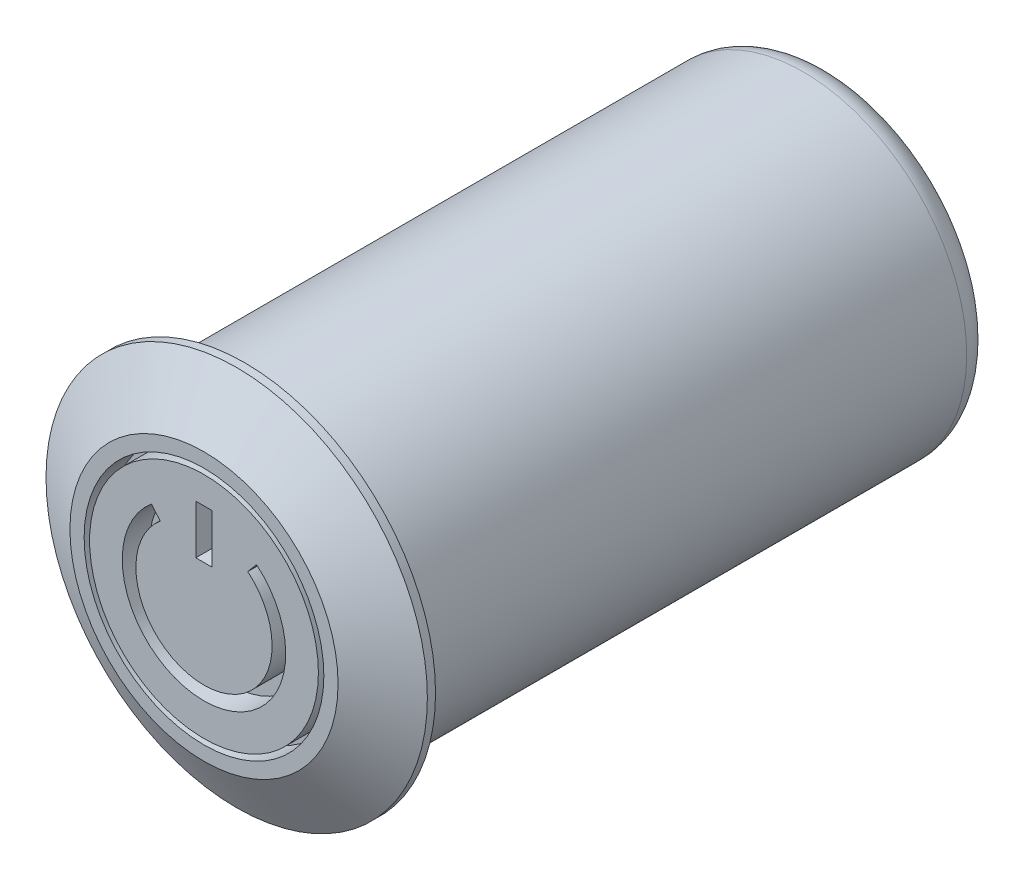
ISO-10303-21;
HEADER;
FILE_DESCRIPTION(('STEP AP214'),'2;1');
FILE_NAME('part.step','',(''),(''),'','','');
FILE_SCHEMA(('AUTOMOTIVE_DESIGN { 1 0 10303 214 1 1 1 1 }'));
ENDSEC;
DATA;
#1=APPLICATION_CONTEXT('core data for automotive mechanical design processes');
#2=APPLICATION_PROTOCOL_DEFINITION('international standard','automotive_design',2000,#1);
#3=PRODUCT_CONTEXT('',#1,'mechanical');
#4=PRODUCT('Part','Part','',(#3));
#5=PRODUCT_RELATED_PRODUCT_CATEGORY('part','',(#4));
#6=PRODUCT_DEFINITION_FORMATION('','',#4);
#7=PRODUCT_DEFINITION_CONTEXT('part definition',#1,'design');
#8=PRODUCT_DEFINITION('design','',#6,#7);
#9=PRODUCT_DEFINITION_SHAPE('','',#8);
#10=(LENGTH_UNIT() NAMED_UNIT(*) SI_UNIT(.MILLI.,.METRE.));
#11=(NAMED_UNIT(*) PLANE_ANGLE_UNIT() SI_UNIT($,.RADIAN.));
#12=(NAMED_UNIT(*) SI_UNIT($,.STERADIAN.) SOLID_ANGLE_UNIT());
#13=UNCERTAINTY_MEASURE_WITH_UNIT(LENGTH_MEASURE(1.E-05),#10,'distance_accuracy_value','');
#14=(GEOMETRIC_REPRESENTATION_CONTEXT(3) GLOBAL_UNCERTAINTY_ASSIGNED_CONTEXT((#13)) GLOBAL_UNIT_ASSIGNED_CONTEXT((#10,
#11,#12)) REPRESENTATION_CONTEXT('',''));
#15=CARTESIAN_POINT('',(0.,0.,0.));
#16=DIRECTION('',(0.,0.,1.));
#17=DIRECTION('',(1.,0.,0.));
#18=AXIS2_PLACEMENT_3D('',#15,#16,#17);
#19=CARTESIAN_POINT('',(0.,0.,1.5));
#20=DIRECTION('',(0.,0.,-1.));
#21=DIRECTION('',(-1.,0.,0.));
#22=AXIS2_PLACEMENT_3D('',#19,#20,#21);
#23=CYLINDRICAL_SURFACE('',#22,7.);
#24=CARTESIAN_POINT('',(0.,0.,0.299999999999999));
#25=DIRECTION('',(0.,0.,1.));
#26=DIRECTION('',(1.,0.,0.));
#27=AXIS2_PLACEMENT_3D('',#24,#25,#26);
#28=CIRCLE('',#27,7.);
#29=CARTESIAN_POINT('',(7.,0.,0.299999999999999));
#30=VERTEX_POINT('',#29);
#31=EDGE_CURVE('E232',#30,#30,#28,.F.);
#32=ORIENTED_EDGE('',*,*,#31,.T.);
#33=EDGE_LOOP('',(#32));
#34=FACE_BOUND('',#33,.T.);
#35=CARTESIAN_POINT('',(0.,0.,0.));
#36=DIRECTION('',(0.,0.,1.));
#37=DIRECTION('',(1.,0.,0.));
#38=AXIS2_PLACEMENT_3D('',#35,#36,#37);
#39=CIRCLE('',#38,7.);
#40=CARTESIAN_POINT('',(7.,0.,0.));
#41=VERTEX_POINT('',#40);
#42=EDGE_CURVE('E221',#41,#41,#39,.T.);
#43=ORIENTED_EDGE('',*,*,#42,.T.);
#44=EDGE_LOOP('',(#43));
#45=FACE_BOUND('',#44,.T.);
#46=ADVANCED_FACE('F91',(#34,#45),#23,.T.);
#47=CARTESIAN_POINT('',(0.,0.,1.5));
#48=DIRECTION('',(0.,0.,1.));
#49=DIRECTION('',(1.,0.,0.));
#50=AXIS2_PLACEMENT_3D('',#47,#48,#49);
#51=PLANE('',#50);
#52=CARTESIAN_POINT('',(0.,0.,1.5));
#53=DIRECTION('',(0.,0.,1.));
#54=DIRECTION('',(1.,0.,0.));
#55=AXIS2_PLACEMENT_3D('',#52,#53,#54);
#56=CIRCLE('',#55,4.4);
#57=CARTESIAN_POINT('',(4.4,0.,1.5));
#58=VERTEX_POINT('',#57);
#59=EDGE_CURVE('E181',#58,#58,#56,.T.);
#60=ORIENTED_EDGE('',*,*,#59,.F.);
#61=EDGE_LOOP('',(#60));
#62=FACE_BOUND('',#61,.T.);
#63=CARTESIAN_POINT('',(0.,0.,1.5));
#64=DIRECTION('',(0.,0.,1.));
#65=DIRECTION('',(1.,0.,0.));
#66=AXIS2_PLACEMENT_3D('',#63,#64,#65);
#67=CIRCLE('',#66,4.92153903091735);
#68=CARTESIAN_POINT('',(4.92153903091735,0.,1.5));
#69=VERTEX_POINT('',#68);
#70=EDGE_CURVE('E229',#69,#69,#67,.T.);
#71=ORIENTED_EDGE('',*,*,#70,.T.);
#72=EDGE_LOOP('',(#71));
#73=FACE_BOUND('',#72,.T.);
#74=ADVANCED_FACE('F251',(#62,#73),#51,.T.);
#75=CARTESIAN_POINT('',(0.,0.,0.));
#76=DIRECTION('',(0.,0.,1.));
#77=DIRECTION('',(1.,0.,0.));
#78=AXIS2_PLACEMENT_3D('',#75,#76,#77);
#79=PLANE('',#78);
#80=CARTESIAN_POINT('',(0.,0.,0.));
#81=DIRECTION('',(0.,0.,1.));
#82=DIRECTION('',(1.,0.,0.));
#83=AXIS2_PLACEMENT_3D('',#80,#81,#82);
#84=CIRCLE('',#83,6.);
#85=CARTESIAN_POINT('',(6.,0.,0.));
#86=VERTEX_POINT('',#85);
#87=EDGE_CURVE('E235',#86,#86,#84,.F.);
#88=ORIENTED_EDGE('',*,*,#87,.F.);
#89=EDGE_LOOP('',(#88));
#90=FACE_BOUND('',#89,.T.);
#91=ORIENTED_EDGE('',*,*,#42,.F.);
#92=EDGE_LOOP('',(#91));
#93=FACE_BOUND('',#92,.T.);
#94=ADVANCED_FACE('F257',(#90,#93),#79,.F.);
#95=CARTESIAN_POINT('',(0.,0.,1.5));
#96=DIRECTION('',(0.,0.,-1.));
#97=DIRECTION('',(-1.,0.,0.));
#98=AXIS2_PLACEMENT_3D('',#95,#96,#97);
#99=CONICAL_SURFACE('',#98,4.92153903091735,1.0471975511966);
#100=ORIENTED_EDGE('',*,*,#31,.F.);
#101=EDGE_LOOP('',(#100));
#102=FACE_BOUND('',#101,.T.);
#103=ORIENTED_EDGE('',*,*,#70,.F.);
#104=EDGE_LOOP('',(#103));
#105=FACE_BOUND('',#104,.T.);
#106=ADVANCED_FACE('F263',(#102,#105),#99,.T.);
#107=CARTESIAN_POINT('',(0.,0.,0.5));
#108=DIRECTION('',(0.,0.,1.));
#109=DIRECTION('',(1.,0.,0.));
#110=AXIS2_PLACEMENT_3D('',#107,#108,#109);
#111=CYLINDRICAL_SURFACE('',#110,4.2);
#112=CARTESIAN_POINT('',(0.,0.,0.5));
#113=DIRECTION('',(0.,0.,1.));
#114=DIRECTION('',(1.,0.,0.));
#115=AXIS2_PLACEMENT_3D('',#112,#113,#114);
#116=CIRCLE('',#115,4.2);
#117=CARTESIAN_POINT('',(4.2,0.,0.5));
#118=VERTEX_POINT('',#117);
#119=EDGE_CURVE('E345',#118,#118,#116,.T.);
#120=ORIENTED_EDGE('',*,*,#119,.T.);
#121=EDGE_LOOP('',(#120));
#122=FACE_BOUND('',#121,.T.);
#123=CARTESIAN_POINT('',(0.,0.,1.5));
#124=DIRECTION('',(0.,0.,1.));
#125=DIRECTION('',(1.,0.,0.));
#126=AXIS2_PLACEMENT_3D('',#123,#124,#125);
#127=CIRCLE('',#126,4.2);
#128=CARTESIAN_POINT('',(4.2,0.,1.5));
#129=VERTEX_POINT('',#128);
#130=EDGE_CURVE('E342',#129,#129,#127,.T.);
#131=ORIENTED_EDGE('',*,*,#130,.F.);
#132=EDGE_LOOP('',(#131));
#133=FACE_BOUND('',#132,.T.);
#134=ADVANCED_FACE('F265',(#122,#133),#111,.T.);
#135=CARTESIAN_POINT('',(0.,0.,0.5));
#136=DIRECTION('',(0.,0.,1.));
#137=DIRECTION('',(1.,0.,0.));
#138=AXIS2_PLACEMENT_3D('',#135,#136,#137);
#139=CYLINDRICAL_SURFACE('',#138,4.4);
#140=CARTESIAN_POINT('',(0.,0.,0.5));
#141=DIRECTION('',(0.,0.,1.));
#142=DIRECTION('',(1.,0.,0.));
#143=AXIS2_PLACEMENT_3D('',#140,#141,#142);
#144=CIRCLE('',#143,4.4);
#145=CARTESIAN_POINT('',(4.4,0.,0.5));
#146=VERTEX_POINT('',#145);
#147=EDGE_CURVE('E188',#146,#146,#144,.T.);
#148=ORIENTED_EDGE('',*,*,#147,.F.);
#149=EDGE_LOOP('',(#148));
#150=FACE_BOUND('',#149,.T.);
#151=ORIENTED_EDGE('',*,*,#59,.T.);
#152=EDGE_LOOP('',(#151));
#153=FACE_BOUND('',#152,.T.);
#154=ADVANCED_FACE('F271',(#150,#153),#139,.F.);
#155=CARTESIAN_POINT('',(0.,0.,0.5));
#156=DIRECTION('',(0.,0.,1.));
#157=DIRECTION('',(1.,0.,0.));
#158=AXIS2_PLACEMENT_3D('',#155,#156,#157);
#159=PLANE('',#158);
#160=ORIENTED_EDGE('',*,*,#119,.F.);
#161=EDGE_LOOP('',(#160));
#162=FACE_BOUND('',#161,.T.);
#163=ORIENTED_EDGE('',*,*,#147,.T.);
#164=EDGE_LOOP('',(#163));
#165=FACE_BOUND('',#164,.T.);
#166=ADVANCED_FACE('F293',(#162,#165),#159,.T.);
#167=CARTESIAN_POINT('',(0.,0.,0.5));
#168=DIRECTION('',(0.,0.,1.));
#169=DIRECTION('',(1.,0.,0.));
#170=AXIS2_PLACEMENT_3D('',#167,#168,#169);
#171=PLANE('',#170);
#172=DIRECTION('',(1.,0.,0.));
#173=VECTOR('',#172,1.);
#174=CARTESIAN_POINT('',(0.,1.4,0.5));
#175=LINE('',#174,#173);
#176=CARTESIAN_POINT('',(-0.3,1.4,0.5));
#177=VERTEX_POINT('',#176);
#178=CARTESIAN_POINT('',(0.3,1.4,0.5));
#179=VERTEX_POINT('',#178);
#180=EDGE_CURVE('E197',#177,#179,#175,.T.);
#181=ORIENTED_EDGE('',*,*,#180,.T.);
#182=DIRECTION('',(0.,1.,0.));
#183=VECTOR('',#182,1.);
#184=CARTESIAN_POINT('',(0.3,0.,0.5));
#185=LINE('',#184,#183);
#186=CARTESIAN_POINT('',(0.3,3.2,0.5));
#187=VERTEX_POINT('',#186);
#188=EDGE_CURVE('E200',#179,#187,#185,.T.);
#189=ORIENTED_EDGE('',*,*,#188,.T.);
#190=DIRECTION('',(1.,0.,0.));
#191=VECTOR('',#190,1.);
#192=CARTESIAN_POINT('',(0.,3.2,0.5));
#193=LINE('',#192,#191);
#194=CARTESIAN_POINT('',(-0.3,3.2,0.5));
#195=VERTEX_POINT('',#194);
#196=EDGE_CURVE('E204',#195,#187,#193,.T.);
#197=ORIENTED_EDGE('',*,*,#196,.F.);
#198=DIRECTION('',(0.,-1.,0.));
#199=VECTOR('',#198,1.);
#200=CARTESIAN_POINT('',(-0.3,0.,0.5));
#201=LINE('',#200,#199);
#202=EDGE_CURVE('E206',#195,#177,#201,.T.);
#203=ORIENTED_EDGE('',*,*,#202,.T.);
#204=EDGE_LOOP('',(#181,#189,#197,#203));
#205=FACE_BOUND('',#204,.T.);
#206=ADVANCED_FACE('F296',(#205),#171,.T.);
#207=CARTESIAN_POINT('',(0.3,0.,0.5));
#208=DIRECTION('',(1.,0.,0.));
#209=DIRECTION('',(0.,0.,-1.));
#210=AXIS2_PLACEMENT_3D('',#207,#208,#209);
#211=PLANE('',#210);
#212=DIRECTION('',(0.,1.,0.));
#213=VECTOR('',#212,1.);
#214=CARTESIAN_POINT('',(0.3,0.,1.5));
#215=LINE('',#214,#213);
#216=CARTESIAN_POINT('',(0.3,1.4,1.5));
#217=VERTEX_POINT('',#216);
#218=CARTESIAN_POINT('',(0.3,3.2,1.5));
#219=VERTEX_POINT('',#218);
#220=EDGE_CURVE('E211',#217,#219,#215,.T.);
#221=ORIENTED_EDGE('',*,*,#220,.T.);
#222=DIRECTION('',(0.,0.,1.));
#223=VECTOR('',#222,1.);
#224=CARTESIAN_POINT('',(0.3,3.2,0.5));
#225=LINE('',#224,#223);
#226=EDGE_CURVE('E224',#187,#219,#225,.T.);
#227=ORIENTED_EDGE('',*,*,#226,.F.);
#228=ORIENTED_EDGE('',*,*,#188,.F.);
#229=DIRECTION('',(0.,0.,1.));
#230=VECTOR('',#229,1.);
#231=CARTESIAN_POINT('',(0.3,1.4,0.5));
#232=LINE('',#231,#230);
#233=EDGE_CURVE('E209',#179,#217,#232,.T.);
#234=ORIENTED_EDGE('',*,*,#233,.T.);
#235=EDGE_LOOP('',(#221,#227,#228,#234));
#236=FACE_BOUND('',#235,.T.);
#237=ADVANCED_FACE('F315',(#236),#211,.F.);
#238=CARTESIAN_POINT('',(0.,3.2,0.5));
#239=DIRECTION('',(0.,-1.,0.));
#240=DIRECTION('',(0.,0.,-1.));
#241=AXIS2_PLACEMENT_3D('',#238,#239,#240);
#242=PLANE('',#241);
#243=DIRECTION('',(1.,0.,0.));
#244=VECTOR('',#243,1.);
#245=CARTESIAN_POINT('',(0.,3.2,1.5));
#246=LINE('',#245,#244);
#247=CARTESIAN_POINT('',(-0.3,3.2,1.5));
#248=VERTEX_POINT('',#247);
#249=EDGE_CURVE('E214',#248,#219,#246,.T.);
#250=ORIENTED_EDGE('',*,*,#249,.F.);
#251=DIRECTION('',(0.,0.,1.));
#252=VECTOR('',#251,1.);
#253=CARTESIAN_POINT('',(-0.3,3.2,0.5));
#254=LINE('',#253,#252);
#255=EDGE_CURVE('E222',#195,#248,#254,.T.);
#256=ORIENTED_EDGE('',*,*,#255,.F.);
#257=ORIENTED_EDGE('',*,*,#196,.T.);
#258=ORIENTED_EDGE('',*,*,#226,.T.);
#259=EDGE_LOOP('',(#250,#256,#257,#258));
#260=FACE_BOUND('',#259,.T.);
#261=ADVANCED_FACE('F321',(#260),#242,.T.);
#262=CARTESIAN_POINT('',(-0.3,0.,0.5));
#263=DIRECTION('',(-1.,0.,0.));
#264=DIRECTION('',(0.,-1.,0.));
#265=AXIS2_PLACEMENT_3D('',#262,#263,#264);
#266=PLANE('',#265);
#267=DIRECTION('',(0.,-1.,0.));
#268=VECTOR('',#267,1.);
#269=CARTESIAN_POINT('',(-0.3,0.,1.5));
#270=LINE('',#269,#268);
#271=CARTESIAN_POINT('',(-0.3,1.4,1.5));
#272=VERTEX_POINT('',#271);
#273=EDGE_CURVE('E201',#248,#272,#270,.T.);
#274=ORIENTED_EDGE('',*,*,#273,.T.);
#275=DIRECTION('',(0.,0.,1.));
#276=VECTOR('',#275,1.);
#277=CARTESIAN_POINT('',(-0.3,1.4,0.5));
#278=LINE('',#277,#276);
#279=EDGE_CURVE('E219',#177,#272,#278,.T.);
#280=ORIENTED_EDGE('',*,*,#279,.F.);
#281=ORIENTED_EDGE('',*,*,#202,.F.);
#282=ORIENTED_EDGE('',*,*,#255,.T.);
#283=EDGE_LOOP('',(#274,#280,#281,#282));
#284=FACE_BOUND('',#283,.T.);
#285=ADVANCED_FACE('F317',(#284),#266,.F.);
#286=CARTESIAN_POINT('',(0.,1.4,0.5));
#287=DIRECTION('',(0.,-1.,0.));
#288=DIRECTION('',(0.,0.,-1.));
#289=AXIS2_PLACEMENT_3D('',#286,#287,#288);
#290=PLANE('',#289);
#291=DIRECTION('',(1.,0.,0.));
#292=VECTOR('',#291,1.);
#293=CARTESIAN_POINT('',(0.,1.4,1.5));
#294=LINE('',#293,#292);
#295=EDGE_CURVE('E114',#272,#217,#294,.T.);
#296=ORIENTED_EDGE('',*,*,#295,.T.);
#297=ORIENTED_EDGE('',*,*,#233,.F.);
#298=ORIENTED_EDGE('',*,*,#180,.F.);
#299=ORIENTED_EDGE('',*,*,#279,.T.);
#300=EDGE_LOOP('',(#296,#297,#298,#299));
#301=FACE_BOUND('',#300,.T.);
#302=ADVANCED_FACE('F320',(#301),#290,.F.);
#303=DIRECTION('',(-0.642787609686543,0.766044443118975,0.));
#304=VECTOR('',#303,1.);
#305=CARTESIAN_POINT('',(0.,0.,1.5));
#306=LINE('',#305,#304);
#307=CARTESIAN_POINT('',(-1.60696902421636,1.91511110779744,1.5));
#308=VERTEX_POINT('',#307);
#309=CARTESIAN_POINT('',(-1.92836282905963,2.29813332935692,1.5));
#310=VERTEX_POINT('',#309);
#311=EDGE_CURVE('E106',#308,#310,#306,.T.);
#312=ORIENTED_EDGE('',*,*,#311,.F.);
#313=CARTESIAN_POINT('',(0.,0.,1.5));
#314=DIRECTION('',(0.,0.,1.));
#315=DIRECTION('',(1.,0.,0.));
#316=AXIS2_PLACEMENT_3D('',#313,#314,#315);
#317=CIRCLE('',#316,2.5);
#318=CARTESIAN_POINT('',(1.60696902421635,1.91511110779745,1.5));
#319=VERTEX_POINT('',#318);
#320=EDGE_CURVE('E175',#308,#319,#317,.T.);
#321=ORIENTED_EDGE('',*,*,#320,.T.);
#322=DIRECTION('',(0.642787609686538,0.766044443118979,0.));
#323=VECTOR('',#322,1.);
#324=CARTESIAN_POINT('',(0.,0.,1.5));
#325=LINE('',#324,#323);
#326=CARTESIAN_POINT('',(1.92836282905961,2.29813332935694,1.5));
#327=VERTEX_POINT('',#326);
#328=EDGE_CURVE('E178',#319,#327,#325,.T.);
#329=ORIENTED_EDGE('',*,*,#328,.T.);
#330=CARTESIAN_POINT('',(0.,0.,1.5));
#331=DIRECTION('',(0.,0.,1.));
#332=DIRECTION('',(1.,0.,0.));
#333=AXIS2_PLACEMENT_3D('',#330,#331,#332);
#334=CIRCLE('',#333,3.);
#335=EDGE_CURVE('E187',#310,#327,#334,.T.);
#336=ORIENTED_EDGE('',*,*,#335,.F.);
#337=EDGE_LOOP('',(#312,#321,#329,#336));
#338=FACE_BOUND('',#337,.T.);
#339=ORIENTED_EDGE('',*,*,#295,.F.);
#340=ORIENTED_EDGE('',*,*,#273,.F.);
#341=ORIENTED_EDGE('',*,*,#249,.T.);
#342=ORIENTED_EDGE('',*,*,#220,.F.);
#343=EDGE_LOOP('',(#339,#340,#341,#342));
#344=FACE_BOUND('',#343,.T.);
#345=ORIENTED_EDGE('',*,*,#130,.T.);
#346=EDGE_LOOP('',(#345));
#347=FACE_BOUND('',#346,.T.);
#348=ADVANCED_FACE('F260',(#338,#344,#347),#51,.T.);
#349=CARTESIAN_POINT('',(0.,0.,0.5));
#350=DIRECTION('',(0.766044443118975,0.642787609686543,0.));
#351=DIRECTION('',(-0.642787609686543,0.766044443118975,0.));
#352=AXIS2_PLACEMENT_3D('',#349,#350,#351);
#353=PLANE('',#352);
#354=ORIENTED_EDGE('',*,*,#311,.T.);
#355=DIRECTION('',(0.,0.,1.));
#356=VECTOR('',#355,1.);
#357=CARTESIAN_POINT('',(-1.92836282905963,2.29813332935692,0.5));
#358=LINE('',#357,#356);
#359=CARTESIAN_POINT('',(-1.92836282905963,2.29813332935692,0.5));
#360=VERTEX_POINT('',#359);
#361=EDGE_CURVE('E154',#360,#310,#358,.T.);
#362=ORIENTED_EDGE('',*,*,#361,.F.);
#363=DIRECTION('',(-0.642787609686543,0.766044443118975,0.));
#364=VECTOR('',#363,1.);
#365=CARTESIAN_POINT('',(0.,0.,0.5));
#366=LINE('',#365,#364);
#367=CARTESIAN_POINT('',(-1.60696902421636,1.91511110779744,0.5));
#368=VERTEX_POINT('',#367);
#369=EDGE_CURVE('E158',#368,#360,#366,.T.);
#370=ORIENTED_EDGE('',*,*,#369,.F.);
#371=DIRECTION('',(0.,0.,1.));
#372=VECTOR('',#371,1.);
#373=CARTESIAN_POINT('',(-1.60696902421636,1.91511110779744,0.5));
#374=LINE('',#373,#372);
#375=EDGE_CURVE('E192',#368,#308,#374,.T.);
#376=ORIENTED_EDGE('',*,*,#375,.T.);
#377=EDGE_LOOP('',(#354,#362,#370,#376));
#378=FACE_BOUND('',#377,.T.);
#379=ADVANCED_FACE('F156',(#378),#353,.F.);
#380=CARTESIAN_POINT('',(0.,0.,0.5));
#381=DIRECTION('',(0.,0.,1.));
#382=DIRECTION('',(1.,0.,0.));
#383=AXIS2_PLACEMENT_3D('',#380,#381,#382);
#384=CYLINDRICAL_SURFACE('',#383,2.5);
#385=ORIENTED_EDGE('',*,*,#320,.F.);
#386=ORIENTED_EDGE('',*,*,#375,.F.);
#387=CARTESIAN_POINT('',(0.,0.,0.5));
#388=DIRECTION('',(0.,0.,1.));
#389=DIRECTION('',(1.,0.,0.));
#390=AXIS2_PLACEMENT_3D('',#387,#388,#389);
#391=CIRCLE('',#390,2.5);
#392=CARTESIAN_POINT('',(1.60696902421635,1.91511110779745,0.5));
#393=VERTEX_POINT('',#392);
#394=EDGE_CURVE('E163',#368,#393,#391,.T.);
#395=ORIENTED_EDGE('',*,*,#394,.T.);
#396=DIRECTION('',(0.,0.,1.));
#397=VECTOR('',#396,1.);
#398=CARTESIAN_POINT('',(1.60696902421635,1.91511110779745,0.5));
#399=LINE('',#398,#397);
#400=EDGE_CURVE('E194',#393,#319,#399,.T.);
#401=ORIENTED_EDGE('',*,*,#400,.T.);
#402=EDGE_LOOP('',(#385,#386,#395,#401));
#403=FACE_BOUND('',#402,.T.);
#404=ADVANCED_FACE('F301',(#403),#384,.T.);
#405=CARTESIAN_POINT('',(0.,0.,0.5));
#406=DIRECTION('',(0.766044443118979,-0.642787609686538,0.));
#407=DIRECTION('',(0.642787609686538,0.766044443118979,0.));
#408=AXIS2_PLACEMENT_3D('',#405,#406,#407);
#409=PLANE('',#408);
#410=ORIENTED_EDGE('',*,*,#328,.F.);
#411=ORIENTED_EDGE('',*,*,#400,.F.);
#412=DIRECTION('',(0.642787609686538,0.766044443118979,0.));
#413=VECTOR('',#412,1.);
#414=CARTESIAN_POINT('',(0.,0.,0.5));
#415=LINE('',#414,#413);
#416=CARTESIAN_POINT('',(1.92836282905961,2.29813332935694,0.5));
#417=VERTEX_POINT('',#416);
#418=EDGE_CURVE('E171',#393,#417,#415,.T.);
#419=ORIENTED_EDGE('',*,*,#418,.T.);
#420=DIRECTION('',(0.,0.,1.));
#421=VECTOR('',#420,1.);
#422=CARTESIAN_POINT('',(1.92836282905961,2.29813332935694,0.5));
#423=LINE('',#422,#421);
#424=EDGE_CURVE('E162',#417,#327,#423,.T.);
#425=ORIENTED_EDGE('',*,*,#424,.T.);
#426=EDGE_LOOP('',(#410,#411,#419,#425));
#427=FACE_BOUND('',#426,.T.);
#428=ADVANCED_FACE('F304',(#427),#409,.T.);
#429=CARTESIAN_POINT('',(0.,0.,0.5));
#430=DIRECTION('',(0.,0.,1.));
#431=DIRECTION('',(1.,0.,0.));
#432=AXIS2_PLACEMENT_3D('',#429,#430,#431);
#433=CYLINDRICAL_SURFACE('',#432,3.);
#434=ORIENTED_EDGE('',*,*,#335,.T.);
#435=ORIENTED_EDGE('',*,*,#424,.F.);
#436=CARTESIAN_POINT('',(0.,0.,0.5));
#437=DIRECTION('',(0.,0.,1.));
#438=DIRECTION('',(1.,0.,0.));
#439=AXIS2_PLACEMENT_3D('',#436,#437,#438);
#440=CIRCLE('',#439,3.);
#441=EDGE_CURVE('E167',#360,#417,#440,.T.);
#442=ORIENTED_EDGE('',*,*,#441,.F.);
#443=ORIENTED_EDGE('',*,*,#361,.T.);
#444=EDGE_LOOP('',(#434,#435,#442,#443));
#445=FACE_BOUND('',#444,.T.);
#446=ADVANCED_FACE('F168',(#445),#433,.F.);
#447=CARTESIAN_POINT('',(0.,0.,0.5));
#448=DIRECTION('',(0.,0.,1.));
#449=DIRECTION('',(1.,0.,0.));
#450=AXIS2_PLACEMENT_3D('',#447,#448,#449);
#451=PLANE('',#450);
#452=ORIENTED_EDGE('',*,*,#369,.T.);
#453=ORIENTED_EDGE('',*,*,#441,.T.);
#454=ORIENTED_EDGE('',*,*,#418,.F.);
#455=ORIENTED_EDGE('',*,*,#394,.F.);
#456=EDGE_LOOP('',(#452,#453,#454,#455));
#457=FACE_BOUND('',#456,.T.);
#458=ADVANCED_FACE('F174',(#457),#451,.T.);
#459=CARTESIAN_POINT('',(0.,0.,-21.5));
#460=DIRECTION('',(0.,0.,1.));
#461=DIRECTION('',(1.,0.,0.));
#462=AXIS2_PLACEMENT_3D('',#459,#460,#461);
#463=CYLINDRICAL_SURFACE('',#462,6.);
#464=CARTESIAN_POINT('',(0.,0.,-20.5));
#465=DIRECTION('',(0.,0.,-1.));
#466=DIRECTION('',(-1.,0.,0.));
#467=AXIS2_PLACEMENT_3D('',#464,#465,#466);
#468=CIRCLE('',#467,6.);
#469=CARTESIAN_POINT('',(-6.,0.,-20.5));
#470=VERTEX_POINT('',#469);
#471=EDGE_CURVE('E12',#470,#470,#468,.F.);
#472=ORIENTED_EDGE('',*,*,#471,.T.);
#473=EDGE_LOOP('',(#472));
#474=FACE_BOUND('',#473,.T.);
#475=ORIENTED_EDGE('',*,*,#87,.T.);
#476=EDGE_LOOP('',(#475));
#477=FACE_BOUND('',#476,.T.);
#478=ADVANCED_FACE('F247',(#474,#477),#463,.T.);
#479=CARTESIAN_POINT('',(0.,0.,-21.5));
#480=DIRECTION('',(0.,0.,-1.));
#481=DIRECTION('',(-1.,0.,0.));
#482=AXIS2_PLACEMENT_3D('',#479,#480,#481);
#483=PLANE('',#482);
#484=CARTESIAN_POINT('',(0.,0.,-21.5));
#485=DIRECTION('',(0.,0.,-1.));
#486=DIRECTION('',(-1.,0.,0.));
#487=AXIS2_PLACEMENT_3D('',#484,#485,#486);
#488=CIRCLE('',#487,5.);
#489=CARTESIAN_POINT('',(-5.,0.,-21.5));
#490=VERTEX_POINT('',#489);
#491=EDGE_CURVE('E99',#490,#490,#488,.T.);
#492=ORIENTED_EDGE('',*,*,#491,.T.);
#493=EDGE_LOOP('',(#492));
#494=FACE_BOUND('',#493,.T.);
#495=ADVANCED_FACE('F240',(#494),#483,.T.);
#496=CARTESIAN_POINT('',(0.,0.,-20.5));
#497=DIRECTION('',(0.,0.,-1.));
#498=DIRECTION('',(-1.,0.,0.));
#499=AXIS2_PLACEMENT_3D('',#496,#497,#498);
#500=TOROIDAL_SURFACE('',#499,5.,1.);
#501=ORIENTED_EDGE('',*,*,#471,.F.);
#502=EDGE_LOOP('',(#501));
#503=FACE_BOUND('',#502,.T.);
#504=ORIENTED_EDGE('',*,*,#491,.F.);
#505=EDGE_LOOP('',(#504));
#506=FACE_BOUND('',#505,.T.);
#507=ADVANCED_FACE('F93',(#503,#506),#500,.T.);
#508=CLOSED_SHELL('',(#46,#74,#94,#106,#134,#154,#166,#206,#237,#261,#285,#302,#348,#379,#404,
#428,#446,#458,#478,#495,#507));
#509=MANIFOLD_SOLID_BREP('B2',#508);
#510=ADVANCED_BREP_SHAPE_REPRESENTATION('',(#18,#509),#14);
#511=SHAPE_DEFINITION_REPRESENTATION(#9,#510);
ENDSEC;
END-ISO-10303-21;
